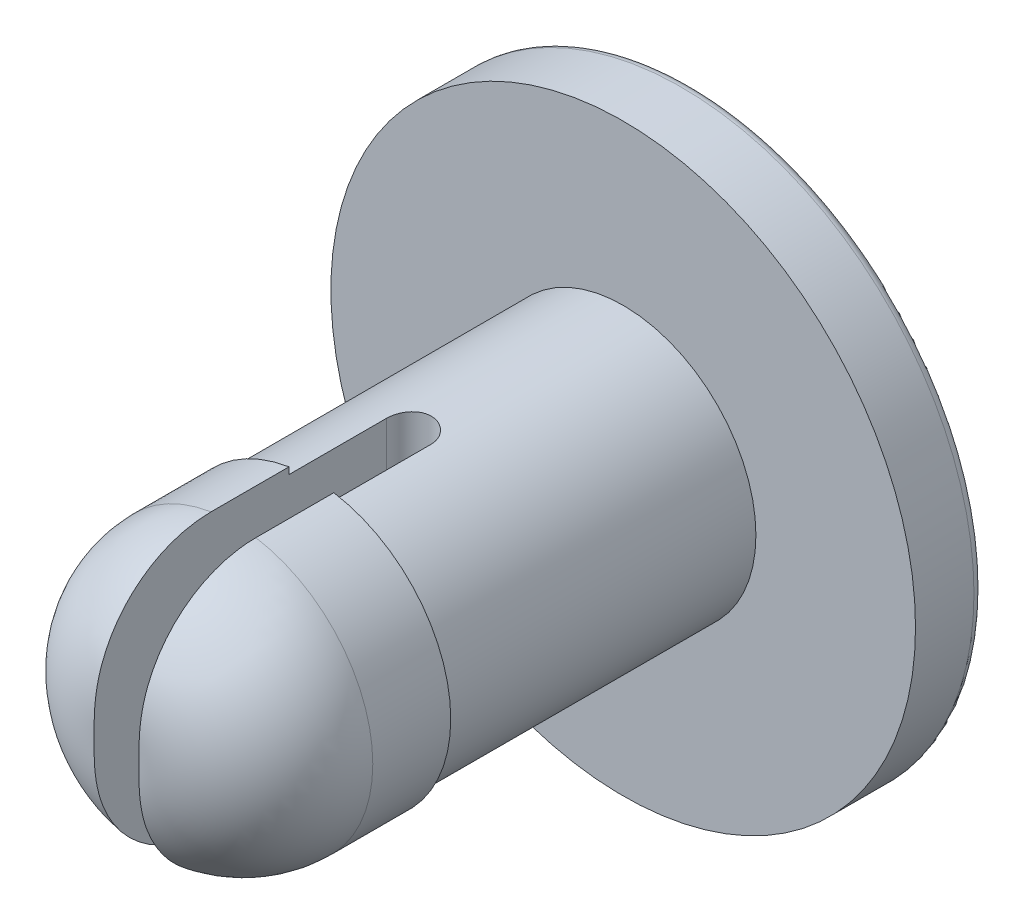
ISO-10303-21;
HEADER;
FILE_DESCRIPTION(('STEP AP214'),'2;1');
FILE_NAME('part.step','',(''),(''),'','','');
FILE_SCHEMA(('AUTOMOTIVE_DESIGN { 1 0 10303 214 1 1 1 1 }'));
ENDSEC;
DATA;
#1=APPLICATION_CONTEXT('core data for automotive mechanical design processes');
#2=APPLICATION_PROTOCOL_DEFINITION('international standard','automotive_design',2000,#1);
#3=PRODUCT_CONTEXT('',#1,'mechanical');
#4=PRODUCT('Part','Part','',(#3));
#5=PRODUCT_RELATED_PRODUCT_CATEGORY('part','',(#4));
#6=PRODUCT_DEFINITION_FORMATION('','',#4);
#7=PRODUCT_DEFINITION_CONTEXT('part definition',#1,'design');
#8=PRODUCT_DEFINITION('design','',#6,#7);
#9=PRODUCT_DEFINITION_SHAPE('','',#8);
#10=(LENGTH_UNIT() NAMED_UNIT(*) SI_UNIT(.MILLI.,.METRE.));
#11=(NAMED_UNIT(*) PLANE_ANGLE_UNIT() SI_UNIT($,.RADIAN.));
#12=(NAMED_UNIT(*) SI_UNIT($,.STERADIAN.) SOLID_ANGLE_UNIT());
#13=UNCERTAINTY_MEASURE_WITH_UNIT(LENGTH_MEASURE(1.E-05),#10,'distance_accuracy_value','');
#14=(GEOMETRIC_REPRESENTATION_CONTEXT(3) GLOBAL_UNCERTAINTY_ASSIGNED_CONTEXT((#13)) GLOBAL_UNIT_ASSIGNED_CONTEXT((#10,
#11,#12)) REPRESENTATION_CONTEXT('',''));
#15=CARTESIAN_POINT('',(0.,0.,0.));
#16=DIRECTION('',(0.,0.,1.));
#17=DIRECTION('',(1.,0.,0.));
#18=AXIS2_PLACEMENT_3D('',#15,#16,#17);
#19=CARTESIAN_POINT('',(0.,0.,14.75));
#20=DIRECTION('',(0.,0.,-1.));
#21=DIRECTION('',(-1.,0.,0.));
#22=AXIS2_PLACEMENT_3D('',#19,#20,#21);
#23=CYLINDRICAL_SURFACE('',#22,3.575);
#24=CARTESIAN_POINT('',(0.,0.,11.75));
#25=DIRECTION('',(0.,0.,1.));
#26=DIRECTION('',(1.,0.,0.));
#27=AXIS2_PLACEMENT_3D('',#24,#25,#26);
#28=CIRCLE('',#27,3.575);
#29=CARTESIAN_POINT('',(0.575,3.52845575287547,11.75));
#30=VERTEX_POINT('',#29);
#31=CARTESIAN_POINT('',(0.575,-3.52845575287547,11.75));
#32=VERTEX_POINT('',#31);
#33=EDGE_CURVE('E190',#30,#32,#28,.F.);
#34=ORIENTED_EDGE('',*,*,#33,.T.);
#35=DIRECTION('',(0.,0.,-1.));
#36=VECTOR('',#35,1.);
#37=CARTESIAN_POINT('',(0.575,-3.52845575287547,14.75));
#38=LINE('',#37,#36);
#39=CARTESIAN_POINT('',(0.575,-3.52845575287547,9.75));
#40=VERTEX_POINT('',#39);
#41=EDGE_CURVE('E192',#32,#40,#38,.T.);
#42=ORIENTED_EDGE('',*,*,#41,.T.);
#43=CARTESIAN_POINT('',(0.,0.,9.75));
#44=DIRECTION('',(0.,0.,1.));
#45=DIRECTION('',(1.,0.,0.));
#46=AXIS2_PLACEMENT_3D('',#43,#44,#45);
#47=CIRCLE('',#46,3.575);
#48=CARTESIAN_POINT('',(0.575,3.52845575287547,9.75));
#49=VERTEX_POINT('',#48);
#50=EDGE_CURVE('E262',#40,#49,#47,.T.);
#51=ORIENTED_EDGE('',*,*,#50,.T.);
#52=DIRECTION('',(0.,0.,-1.));
#53=VECTOR('',#52,1.);
#54=CARTESIAN_POINT('',(0.575,3.52845575287547,14.75));
#55=LINE('',#54,#53);
#56=EDGE_CURVE('E194',#49,#30,#55,.F.);
#57=ORIENTED_EDGE('',*,*,#56,.T.);
#58=EDGE_LOOP('',(#34,#42,#51,#57));
#59=FACE_BOUND('',#58,.T.);
#60=ADVANCED_FACE('F45',(#59),#23,.T.);
#61=CARTESIAN_POINT('',(0.,0.,9.75));
#62=DIRECTION('',(0.,0.,1.));
#63=DIRECTION('',(1.,0.,0.));
#64=AXIS2_PLACEMENT_3D('',#61,#62,#63);
#65=PLANE('',#64);
#66=ORIENTED_EDGE('',*,*,#50,.F.);
#67=DIRECTION('',(0.,1.,0.));
#68=VECTOR('',#67,1.);
#69=CARTESIAN_POINT('',(0.575,0.,9.75));
#70=LINE('',#69,#68);
#71=CARTESIAN_POINT('',(0.575,-3.35609892583636,9.75));
#72=VERTEX_POINT('',#71);
#73=EDGE_CURVE('E271',#40,#72,#70,.T.);
#74=ORIENTED_EDGE('',*,*,#73,.T.);
#75=CARTESIAN_POINT('',(0.,0.,9.75));
#76=DIRECTION('',(0.,0.,1.));
#77=DIRECTION('',(1.,0.,0.));
#78=AXIS2_PLACEMENT_3D('',#75,#76,#77);
#79=CIRCLE('',#78,3.405);
#80=CARTESIAN_POINT('',(0.575,3.35609892583636,9.75));
#81=VERTEX_POINT('',#80);
#82=EDGE_CURVE('E258',#72,#81,#79,.T.);
#83=ORIENTED_EDGE('',*,*,#82,.T.);
#84=EDGE_CURVE('E272',#81,#49,#70,.T.);
#85=ORIENTED_EDGE('',*,*,#84,.T.);
#86=EDGE_LOOP('',(#66,#74,#83,#85));
#87=FACE_BOUND('',#86,.T.);
#88=ADVANCED_FACE('F170',(#87),#65,.F.);
#89=CARTESIAN_POINT('',(0.,0.,11.75));
#90=DIRECTION('',(0.,0.,1.));
#91=DIRECTION('',(1.,0.,0.));
#92=AXIS2_PLACEMENT_3D('',#89,#90,#91);
#93=DEGENERATE_TOROIDAL_SURFACE('',#92,0.575,3.,.T.);
#94=ORIENTED_EDGE('',*,*,#33,.F.);
#95=CARTESIAN_POINT('',(0.575,0.,14.7500000000003));
#96=CARTESIAN_POINT('',(0.575,0.0479599910289937,14.7499991412129));
#97=CARTESIAN_POINT('',(0.575,0.0959199947458596,14.7500179982622));
#98=CARTESIAN_POINT('',(0.575,0.191832562200003,14.7498772513586));
#99=CARTESIAN_POINT('',(0.575,0.23978512593959,14.7497176750342));
#100=CARTESIAN_POINT('',(0.575,0.33563694348702,14.7487424297266));
#101=CARTESIAN_POINT('',(0.575,0.38353620095613,14.7479274420565));
#102=CARTESIAN_POINT('',(0.575,0.479301862870731,14.7451708436416));
#103=CARTESIAN_POINT('',(0.575,0.527168267673822,14.743229245361));
#104=CARTESIAN_POINT('',(0.575,0.672461643034071,14.7350320846635));
#105=CARTESIAN_POINT('',(0.575,0.769779333272116,14.7263907062388));
#106=CARTESIAN_POINT('',(0.575,0.963396748975621,14.7010961388807));
#107=CARTESIAN_POINT('',(0.575,1.05969647809974,14.6844429787526));
#108=CARTESIAN_POINT('',(0.575,1.25042136801084,14.6425269643835));
#109=CARTESIAN_POINT('',(0.575,1.34484648739453,14.6172639202049));
#110=CARTESIAN_POINT('',(0.575,1.53095011334402,14.5579784133012));
#111=CARTESIAN_POINT('',(0.575,1.6226276813196,14.5239529944972));
#112=CARTESIAN_POINT('',(0.575,1.80030549538096,14.4481326880269));
#113=CARTESIAN_POINT('',(0.575,1.88638669086819,14.4065276036336));
#114=CARTESIAN_POINT('',(0.575,2.05422262004047,14.3153555555573));
#115=CARTESIAN_POINT('',(0.575,2.13597747313636,14.2657888117755));
#116=CARTESIAN_POINT('',(0.575,2.29446562359141,14.1590336445313));
#117=CARTESIAN_POINT('',(0.575,2.37119439215784,14.1018384845442));
#118=CARTESIAN_POINT('',(0.575,2.51879832517957,13.9803866214287));
#119=CARTESIAN_POINT('',(0.575,2.58967400180558,13.9161305373107));
#120=CARTESIAN_POINT('',(0.575,2.77702057827132,13.7290508451309));
#121=CARTESIAN_POINT('',(0.575,2.88662335027905,13.5991986196902));
#122=CARTESIAN_POINT('',(0.575,3.08200511305904,13.3229073404814));
#123=CARTESIAN_POINT('',(0.575,3.16780344102312,13.1764818866905));
#124=CARTESIAN_POINT('',(0.575,3.31235217931218,12.8729932564601));
#125=CARTESIAN_POINT('',(0.575,3.37141647667744,12.7160797628945));
#126=CARTESIAN_POINT('',(0.575,3.46228387035127,12.394526258259));
#127=CARTESIAN_POINT('',(0.575,3.49408321071544,12.2298851859532));
#128=CARTESIAN_POINT('',(0.575,3.52943736331524,11.8980992056835));
#129=CARTESIAN_POINT('',(0.575,3.53307671741405,11.7309633027567));
#130=CARTESIAN_POINT('',(0.575,3.51222724877617,11.3984387639373));
#131=CARTESIAN_POINT('',(0.575,3.48773570703064,11.2330502985038));
#132=CARTESIAN_POINT('',(0.575,3.41133734090401,10.9087910224172));
#133=CARTESIAN_POINT('',(0.575,3.3594397374322,10.7499180389602));
#134=CARTESIAN_POINT('',(0.575,3.22976447307926,10.4432140966451));
#135=CARTESIAN_POINT('',(0.575,3.15200062300593,10.2953772966862));
#136=CARTESIAN_POINT('',(0.575,2.97277186425385,10.0147475913224));
#137=CARTESIAN_POINT('',(0.575,2.87129616535442,9.88196157584405));
#138=CARTESIAN_POINT('',(0.575,2.64741828195816,9.63501309078978));
#139=CARTESIAN_POINT('',(0.575,2.52498065079896,9.52088281783979));
#140=CARTESIAN_POINT('',(0.575,2.26201782998047,9.31403458858148));
#141=CARTESIAN_POINT('',(0.575,2.12139865463877,9.22143542900224));
#142=CARTESIAN_POINT('',(0.575,1.90094066265467,9.10123491149998));
#143=CARTESIAN_POINT('',(0.575,1.82601928077855,9.06433743475622));
#144=CARTESIAN_POINT('',(0.575,1.67337233185528,8.99679043890362));
#145=CARTESIAN_POINT('',(0.575,1.59564623277232,8.96614211262737));
#146=CARTESIAN_POINT('',(0.575,1.43693869532928,8.91086517914634));
#147=CARTESIAN_POINT('',(0.575,1.35592781837499,8.88632143549156));
#148=CARTESIAN_POINT('',(0.575,1.19225090748555,8.84377361023155));
#149=CARTESIAN_POINT('',(0.575,1.10958563192291,8.82576660150918));
#150=CARTESIAN_POINT('',(0.575,0.942535247043865,8.79594467838634));
#151=CARTESIAN_POINT('',(0.575,0.858141992762495,8.78417586820207));
#152=CARTESIAN_POINT('',(0.575,0.688736722387002,8.76641554939411));
#153=CARTESIAN_POINT('',(0.575,0.603724463702506,8.7604264439515));
#154=CARTESIAN_POINT('',(0.575,0.44944935022267,8.75354363320153));
#155=CARTESIAN_POINT('',(0.575,0.380213763905963,8.75190658992261));
#156=CARTESIAN_POINT('',(0.575,0.241718360224682,8.75015837504525));
#157=CARTESIAN_POINT('',(0.575,0.172458540785936,8.75004750982229));
#158=CARTESIAN_POINT('',(0.575,0.068527560856317,8.7499973275468));
#159=CARTESIAN_POINT('',(0.575,0.0338557234246653,8.74999999008686));
#160=CARTESIAN_POINT('',(0.575,-0.0354879495451869,8.75000000991324));
#161=CARTESIAN_POINT('',(0.575,-0.0701597850833441,8.74999736720562));
#162=CARTESIAN_POINT('',(0.575,-0.174175592702176,8.75005018322577));
#163=CARTESIAN_POINT('',(0.575,-0.243520016759352,8.75016638582052));
#164=CARTESIAN_POINT('',(0.575,-0.381765624570001,8.75194067632099));
#165=CARTESIAN_POINT('',(0.575,-0.450666863896799,8.75358910141183));
#166=CARTESIAN_POINT('',(0.575,-0.58834572032591,8.75974932097495));
#167=CARTESIAN_POINT('',(0.575,-0.657123354579998,8.764260681485));
#168=CARTESIAN_POINT('',(0.575,-0.794173076198699,8.77691149122077));
#169=CARTESIAN_POINT('',(0.575,-0.862446016931903,8.78504137983715));
#170=CARTESIAN_POINT('',(0.575,-0.998389857807109,8.80534203494857));
#171=CARTESIAN_POINT('',(0.575,-1.06606077896101,8.81751265983977));
#172=CARTESIAN_POINT('',(0.575,-1.21716099908607,8.84964325476365));
#173=CARTESIAN_POINT('',(0.575,-1.30034303124201,8.87078577932007));
#174=CARTESIAN_POINT('',(0.575,-1.46479494978354,8.91984281878721));
#175=CARTESIAN_POINT('',(0.575,-1.54606245551717,8.94776532229379));
#176=CARTESIAN_POINT('',(0.575,-1.70595337642327,9.01031005248946));
#177=CARTESIAN_POINT('',(0.575,-1.78457759193779,9.04493022940038));
#178=CARTESIAN_POINT('',(0.575,-1.93857319040189,9.12069238282417));
#179=CARTESIAN_POINT('',(0.575,-2.0139460622768,9.16183133290256));
#180=CARTESIAN_POINT('',(0.575,-2.16100777005591,9.25045993168252));
#181=CARTESIAN_POINT('',(0.575,-2.23269154353323,9.29795800116097));
#182=CARTESIAN_POINT('',(0.575,-2.37171013697071,9.39892619582676));
#183=CARTESIAN_POINT('',(0.575,-2.4390442015144,9.45239735398652));
#184=CARTESIAN_POINT('',(0.575,-2.63381909294934,9.62132193415628));
#185=CARTESIAN_POINT('',(0.575,-2.75405632043521,9.7453007531947));
#186=CARTESIAN_POINT('',(0.575,-2.96879004550762,10.0090733047604));
#187=CARTESIAN_POINT('',(0.575,-3.06380560133856,10.1484476353145));
#188=CARTESIAN_POINT('',(0.575,-3.22887129870692,10.4412123488175));
#189=CARTESIAN_POINT('',(0.575,-3.29893379833932,10.5945957462987));
#190=CARTESIAN_POINT('',(0.575,-3.41168670668405,10.9099098633585));
#191=CARTESIAN_POINT('',(0.575,-3.45456242265776,11.0717743944807));
#192=CARTESIAN_POINT('',(0.575,-3.51247876787784,11.4004316192547));
#193=CARTESIAN_POINT('',(0.575,-3.52751625516098,11.5672248670283));
#194=CARTESIAN_POINT('',(0.575,-3.52930795424931,11.9006189528432));
#195=CARTESIAN_POINT('',(0.575,-3.51612011430437,12.0672194838406));
#196=CARTESIAN_POINT('',(0.575,-3.46195720983408,12.3958511463293));
#197=CARTESIAN_POINT('',(0.575,-3.42098048733543,12.5578820045786));
#198=CARTESIAN_POINT('',(0.575,-3.31241403755377,12.8727791564908));
#199=CARTESIAN_POINT('',(0.575,-3.24482229018123,13.0256447534921));
#200=CARTESIAN_POINT('',(0.575,-3.0849947504769,13.3178243179938));
#201=CARTESIAN_POINT('',(0.575,-2.99276854627004,13.4571435292487));
#202=CARTESIAN_POINT('',(0.575,-2.78621262431414,13.7185403382491));
#203=CARTESIAN_POINT('',(0.575,-2.67185632524166,13.8405968928826));
#204=CARTESIAN_POINT('',(0.575,-2.42414902411836,14.0640915669687));
#205=CARTESIAN_POINT('',(0.575,-2.29077396185854,14.1655031683172));
#206=CARTESIAN_POINT('',(0.575,-2.07917087731759,14.3002158262));
#207=CARTESIAN_POINT('',(0.575,-2.00641260944294,14.3423465041849));
#208=CARTESIAN_POINT('',(0.575,-1.85762585956692,14.4204229741512));
#209=CARTESIAN_POINT('',(0.575,-1.78159733744112,14.456368690219));
#210=CARTESIAN_POINT('',(0.575,-1.62712896515148,14.5217519637556));
#211=CARTESIAN_POINT('',(0.575,-1.54869899647824,14.5512129386206));
#212=CARTESIAN_POINT('',(0.575,-1.38972508865614,14.6037130974403));
#213=CARTESIAN_POINT('',(0.575,-1.30918115384725,14.6267522945777));
#214=CARTESIAN_POINT('',(0.575,-1.12803004742938,14.6709722209561));
#215=CARTESIAN_POINT('',(0.575,-1.02702679978793,14.690537980588));
#216=CARTESIAN_POINT('',(0.575,-0.823703067693475,14.7205803168352));
#217=CARTESIAN_POINT('',(0.575,-0.721382441941373,14.7310559100768));
#218=CARTESIAN_POINT('',(0.575,-0.567378183989949,14.7412576606692));
#219=CARTESIAN_POINT('',(0.575,-0.515848091997465,14.7437390161707));
#220=CARTESIAN_POINT('',(0.575,-0.412736470801467,14.7472836577622));
#221=CARTESIAN_POINT('',(0.575,-0.361154938444676,14.7483468507924));
#222=CARTESIAN_POINT('',(0.575,-0.257977057278723,14.7496229300072));
#223=CARTESIAN_POINT('',(0.575,-0.206380707441016,14.7498356717515));
#224=CARTESIAN_POINT('',(0.575,-0.103189576631836,14.7500246652872));
#225=CARTESIAN_POINT('',(0.575,-0.0515947956578849,14.7500009238737));
#226=CARTESIAN_POINT('',(0.575,0.,14.7500000000003));
#227=B_SPLINE_CURVE_WITH_KNOTS('',3,(#95,#96,#97,#98,#99,#100,#101,#102,#103,#104,#105,#106,
#107,#108,#109,#110,#111,#112,#113,#114,#115,#116,#117,#118,#119,#120,#121,#122,#123,#124,#125,
#126,#127,#128,#129,#130,#131,#132,#133,#134,#135,#136,#137,#138,#139,#140,#141,#142,#143,#144,
#145,#146,#147,#148,#149,#150,#151,#152,#153,#154,#155,#156,#157,#158,#159,#160,#161,#162,#163,
#164,#165,#166,#167,#168,#169,#170,#171,#172,#173,#174,#175,#176,#177,#178,#179,#180,#181,#182,
#183,#184,#185,#186,#187,#188,#189,#190,#191,#192,#193,#194,#195,#196,#197,#198,#199,#200,#201,
#202,#203,#204,#205,#206,#207,#208,#209,#210,#211,#212,#213,#214,#215,#216,#217,#218,#219,#220,
#221,#222,#223,#224,#225,#226),.UNSPECIFIED.,.T.,.F.,(4,2,2,2,2,2,2,2,2,2,2,2,2,2,2,2,2,2,2,2,2,
2,2,2,2,2,2,2,2,2,2,2,2,2,2,2,2,2,2,2,2,2,2,2,2,2,2,2,2,2,2,2,2,2,2,2,2,2,2,2,2,2,2,2,2,4),(0.,
0.143880000540278,0.2877377258834,0.43144610127396,0.575152886774315,0.867968947344715,
1.16078395514467,1.45360542298155,1.74652580691722,2.0329259395156,2.31931816309227,
2.60596499030432,2.89258670805081,3.39970070259918,3.9064015362654,4.40698815041654,
4.90764371290844,5.4067956227147,5.90599578241268,6.4050280905811,6.90379437616826,
7.40278807190859,7.90263405509752,8.40517572289085,8.6554878579734,8.90584772778969,
9.15951466095088,9.41306786279993,9.66846973784353,9.92397776239912,10.131711944561,
10.3394878281047,10.4435035866399,10.5475192260912,10.7555500520708,10.9622777883529,
11.1689741964364,11.3751276987052,11.5812739772788,11.8384669966073,12.0959645400487,
12.3533834023985,12.6106831026055,12.868326953992,13.1260154309044,13.641310442957,
14.1449920010265,14.6484237608923,15.1483861215639,15.6484049070758,16.1473981096126,
16.6464210862936,17.145481946293,17.6443488461434,18.1438187160422,18.6439261541233,
18.8959136451711,19.1479042288654,19.398969337071,19.6500339298802,19.9582105443363,
20.2664204931631,20.4211729193059,20.5759354997991,20.7307243639885,20.8855087804961),.UNSPECIFIED.);
#228=EDGE_CURVE('E143',#32,#30,#227,.T.);
#229=ORIENTED_EDGE('',*,*,#228,.F.);
#230=EDGE_LOOP('',(#94,#229));
#231=FACE_BOUND('',#230,.T.);
#232=ADVANCED_FACE('F184',(#231),#93,.T.);
#233=CARTESIAN_POINT('',(0.,0.,1.75));
#234=DIRECTION('',(0.,0.,-1.));
#235=DIRECTION('',(-1.,0.,0.));
#236=AXIS2_PLACEMENT_3D('',#233,#234,#235);
#237=CYLINDRICAL_SURFACE('',#236,7.5);
#238=CARTESIAN_POINT('',(0.,0.,0.25));
#239=DIRECTION('',(0.,0.,1.));
#240=DIRECTION('',(1.,0.,0.));
#241=AXIS2_PLACEMENT_3D('',#238,#239,#240);
#242=CIRCLE('',#241,7.5);
#243=CARTESIAN_POINT('',(7.5,0.,0.25));
#244=VERTEX_POINT('',#243);
#245=EDGE_CURVE('E249',#244,#244,#242,.T.);
#246=ORIENTED_EDGE('',*,*,#245,.T.);
#247=EDGE_LOOP('',(#246));
#248=FACE_BOUND('',#247,.T.);
#249=CARTESIAN_POINT('',(0.,0.,1.75));
#250=DIRECTION('',(0.,0.,1.));
#251=DIRECTION('',(1.,0.,0.));
#252=AXIS2_PLACEMENT_3D('',#249,#250,#251);
#253=CIRCLE('',#252,7.5);
#254=CARTESIAN_POINT('',(7.5,0.,1.75));
#255=VERTEX_POINT('',#254);
#256=EDGE_CURVE('E251',#255,#255,#253,.T.);
#257=ORIENTED_EDGE('',*,*,#256,.F.);
#258=EDGE_LOOP('',(#257));
#259=FACE_BOUND('',#258,.T.);
#260=ADVANCED_FACE('F225',(#248,#259),#237,.T.);
#261=CARTESIAN_POINT('',(0.,0.,1.75));
#262=DIRECTION('',(0.,0.,1.));
#263=DIRECTION('',(1.,0.,0.));
#264=AXIS2_PLACEMENT_3D('',#261,#262,#263);
#265=PLANE('',#264);
#266=CARTESIAN_POINT('',(0.,0.,1.75));
#267=DIRECTION('',(0.,0.,1.));
#268=DIRECTION('',(1.,0.,0.));
#269=AXIS2_PLACEMENT_3D('',#266,#267,#268);
#270=CIRCLE('',#269,3.405);
#271=CARTESIAN_POINT('',(3.405,0.,1.75));
#272=VERTEX_POINT('',#271);
#273=EDGE_CURVE('E199',#272,#272,#270,.T.);
#274=ORIENTED_EDGE('',*,*,#273,.F.);
#275=EDGE_LOOP('',(#274));
#276=FACE_BOUND('',#275,.T.);
#277=ORIENTED_EDGE('',*,*,#256,.T.);
#278=EDGE_LOOP('',(#277));
#279=FACE_BOUND('',#278,.T.);
#280=ADVANCED_FACE('F229',(#276,#279),#265,.T.);
#281=CARTESIAN_POINT('',(0.,0.,0.));
#282=DIRECTION('',(0.,0.,1.));
#283=DIRECTION('',(1.,0.,0.));
#284=AXIS2_PLACEMENT_3D('',#281,#282,#283);
#285=PLANE('',#284);
#286=CARTESIAN_POINT('',(0.,0.,0.));
#287=DIRECTION('',(0.,0.,1.));
#288=DIRECTION('',(1.,0.,0.));
#289=AXIS2_PLACEMENT_3D('',#286,#287,#288);
#290=CIRCLE('',#289,7.25);
#291=CARTESIAN_POINT('',(7.25,0.,0.));
#292=VERTEX_POINT('',#291);
#293=EDGE_CURVE('E204',#292,#292,#290,.F.);
#294=ORIENTED_EDGE('',*,*,#293,.T.);
#295=EDGE_LOOP('',(#294));
#296=FACE_BOUND('',#295,.T.);
#297=ADVANCED_FACE('F235',(#296),#285,.F.);
#298=CARTESIAN_POINT('',(0.,0.,0.25));
#299=DIRECTION('',(0.,0.,1.));
#300=DIRECTION('',(1.,0.,0.));
#301=AXIS2_PLACEMENT_3D('',#298,#299,#300);
#302=TOROIDAL_SURFACE('',#301,7.25,0.25);
#303=ORIENTED_EDGE('',*,*,#293,.F.);
#304=EDGE_LOOP('',(#303));
#305=FACE_BOUND('',#304,.T.);
#306=ORIENTED_EDGE('',*,*,#245,.F.);
#307=EDGE_LOOP('',(#306));
#308=FACE_BOUND('',#307,.T.);
#309=ADVANCED_FACE('F176',(#305,#308),#302,.T.);
#310=CARTESIAN_POINT('',(0.,0.,9.75));
#311=DIRECTION('',(0.,0.,-1.));
#312=DIRECTION('',(-1.,0.,0.));
#313=AXIS2_PLACEMENT_3D('',#310,#311,#312);
#314=CYLINDRICAL_SURFACE('',#313,3.405);
#315=CARTESIAN_POINT('',(-0.575,3.35609892583636,7.25));
#316=CARTESIAN_POINT('',(-0.575028553460308,3.35608091234908,7.21789614390163));
#317=CARTESIAN_POINT('',(-0.57231316122703,3.35655909033629,7.18580575269618));
#318=CARTESIAN_POINT('',(-0.561611498058461,3.35837313609114,7.1225829409983));
#319=CARTESIAN_POINT('',(-0.553632226183392,3.35970786489128,7.09144930581698));
#320=CARTESIAN_POINT('',(-0.532616530332993,3.36310134226726,7.03097468846981));
#321=CARTESIAN_POINT('',(-0.519579028785024,3.36516024510774,7.0016340898236));
#322=CARTESIAN_POINT('',(-0.488835438029434,3.36976368032886,6.94555467374316));
#323=CARTESIAN_POINT('',(-0.471129262369008,3.37230822170214,6.91881590450121));
#324=CARTESIAN_POINT('',(-0.43136043022401,3.37762602666929,6.86843418228707));
#325=CARTESIAN_POINT('',(-0.40926022478589,3.38040113244897,6.84482105814915));
#326=CARTESIAN_POINT('',(-0.361409912485525,3.38585097187183,6.80161726303588));
#327=CARTESIAN_POINT('',(-0.335659246823948,3.3885256900686,6.78202720902393));
#328=CARTESIAN_POINT('',(-0.281044997136995,3.39349288028389,6.74731532676686));
#329=CARTESIAN_POINT('',(-0.252163339195771,3.39578291465484,6.73222155647942));
#330=CARTESIAN_POINT('',(-0.192231033951128,3.39970188348304,6.7071118412523));
#331=CARTESIAN_POINT('',(-0.161180654837275,3.40133089951444,6.69709526971384));
#332=CARTESIAN_POINT('',(-0.0981023249580895,3.40373136579406,6.68251531984894));
#333=CARTESIAN_POINT('',(-0.0660863923628076,3.40451077839036,6.67790127898832));
#334=CARTESIAN_POINT('',(-0.00172517098452716,3.40515159150105,6.67409976984125));
#335=CARTESIAN_POINT('',(0.0306201025762815,3.40501303425355,6.67491205187594));
#336=CARTESIAN_POINT('',(0.0943736783540715,3.40383978028279,6.68190088586224));
#337=CARTESIAN_POINT('',(0.125788165728134,3.40281421676883,6.68802276840947));
#338=CARTESIAN_POINT('',(0.187137303725755,3.399992384238,6.70537086500291));
#339=CARTESIAN_POINT('',(0.217071917843988,3.39819609621955,6.71659720489565));
#340=CARTESIAN_POINT('',(0.274774466237098,3.39401909188096,6.74388985257192));
#341=CARTESIAN_POINT('',(0.30253153311382,3.39163566315497,6.75997870420084));
#342=CARTESIAN_POINT('',(0.354971460710831,3.38654918337844,6.79652258720238));
#343=CARTESIAN_POINT('',(0.379654179437337,3.38384611757616,6.81697782012511));
#344=CARTESIAN_POINT('',(0.425566015223457,3.37838136637451,6.86197370785934));
#345=CARTESIAN_POINT('',(0.446748784074379,3.375619369165,6.88656163743122));
#346=CARTESIAN_POINT('',(0.484701577803032,3.37037946155732,6.9389754478981));
#347=CARTESIAN_POINT('',(0.501470347236478,3.36790163209592,6.96680224676443));
#348=CARTESIAN_POINT('',(0.530128792999367,3.36351004878725,7.02496235562378));
#349=CARTESIAN_POINT('',(0.542009923360474,3.36159728458034,7.05529994541959));
#350=CARTESIAN_POINT('',(0.560477635561629,3.35856798090226,7.11755912055766));
#351=CARTESIAN_POINT('',(0.567072130667574,3.35745025167194,7.14947826222808));
#352=CARTESIAN_POINT('',(0.572285888587643,3.35656294591983,7.19303410276371));
#353=CARTESIAN_POINT('',(0.573304101006304,3.3563890959323,7.2044128426278));
#354=CARTESIAN_POINT('',(0.574660272744341,3.35615720174549,7.22719272616396));
#355=CARTESIAN_POINT('',(0.574999376016171,3.35609896280205,7.23859379972343));
#356=CARTESIAN_POINT('',(0.575000000000001,3.35609892583637,7.25));
#357=B_SPLINE_CURVE_WITH_KNOTS('',3,(#315,#316,#317,#318,#319,#320,#321,#322,#323,#324,#325,
#326,#327,#328,#329,#330,#331,#332,#333,#334,#335,#336,#337,#338,#339,#340,#341,#342,#343,#344,
#345,#346,#347,#348,#349,#350,#351,#352,#353,#354,#355,#356),.UNSPECIFIED.,.F.,.F.,(4,2,2,2,2,2,
2,2,2,2,2,2,2,2,2,2,2,2,2,2,4),(0.,0.0961731624966529,0.192218706439643,0.28828472255097,
0.384352517702736,0.481279566923373,0.578221469442101,0.675756217445887,0.773278925337352,
0.869879592263948,0.966475814379733,1.06208910060606,1.15770474423314,1.25377066973883,
1.34984103056191,1.44709624196097,1.5443790851921,1.6418313104581,1.73913739119283,
1.77339833211336,1.80760151211994),.UNSPECIFIED.);
#358=CARTESIAN_POINT('',(-0.575,3.35609892583636,7.25));
#359=VERTEX_POINT('',#358);
#360=CARTESIAN_POINT('',(0.575,3.35609892583636,7.25));
#361=VERTEX_POINT('',#360);
#362=EDGE_CURVE('E11',#359,#361,#357,.T.);
#363=ORIENTED_EDGE('',*,*,#362,.T.);
#364=DIRECTION('',(0.,0.,-1.));
#365=VECTOR('',#364,1.);
#366=CARTESIAN_POINT('',(0.575,3.35609892583636,9.75));
#367=LINE('',#366,#365);
#368=EDGE_CURVE('E267',#361,#81,#367,.F.);
#369=ORIENTED_EDGE('',*,*,#368,.T.);
#370=ORIENTED_EDGE('',*,*,#82,.F.);
#371=DIRECTION('',(0.,0.,-1.));
#372=VECTOR('',#371,1.);
#373=CARTESIAN_POINT('',(0.575,-3.35609892583636,9.75));
#374=LINE('',#373,#372);
#375=CARTESIAN_POINT('',(0.575,-3.35609892583636,7.25));
#376=VERTEX_POINT('',#375);
#377=EDGE_CURVE('E76',#72,#376,#374,.T.);
#378=ORIENTED_EDGE('',*,*,#377,.T.);
#379=CARTESIAN_POINT('',(0.575,-3.35609892583636,7.25));
#380=CARTESIAN_POINT('',(0.575028553460309,-3.35608091234908,7.21789614390162));
#381=CARTESIAN_POINT('',(0.57231316122703,-3.35655909033629,7.18580575269618));
#382=CARTESIAN_POINT('',(0.561611498058461,-3.35837313609114,7.1225829409983));
#383=CARTESIAN_POINT('',(0.553632226183392,-3.35970786489128,7.09144930581698));
#384=CARTESIAN_POINT('',(0.532616530332994,-3.36310134226726,7.03097468846981));
#385=CARTESIAN_POINT('',(0.519579028785024,-3.36516024510774,7.0016340898236));
#386=CARTESIAN_POINT('',(0.488835438029435,-3.36976368032886,6.94555467374316));
#387=CARTESIAN_POINT('',(0.471129262369008,-3.37230822170214,6.91881590450121));
#388=CARTESIAN_POINT('',(0.431360430224011,-3.37762602666929,6.86843418228707));
#389=CARTESIAN_POINT('',(0.40926022478589,-3.38040113244897,6.84482105814915));
#390=CARTESIAN_POINT('',(0.361409912485526,-3.38585097187183,6.80161726303588));
#391=CARTESIAN_POINT('',(0.335659246823948,-3.3885256900686,6.78202720902393));
#392=CARTESIAN_POINT('',(0.281044997136995,-3.39349288028389,6.74731532676686));
#393=CARTESIAN_POINT('',(0.252163339195772,-3.39578291465484,6.73222155647942));
#394=CARTESIAN_POINT('',(0.192231033951128,-3.39970188348304,6.7071118412523));
#395=CARTESIAN_POINT('',(0.161180654837275,-3.40133089951444,6.69709526971384));
#396=CARTESIAN_POINT('',(0.0981023249580897,-3.40373136579406,6.68251531984894));
#397=CARTESIAN_POINT('',(0.0660863923628078,-3.40451077839036,6.67790127898832));
#398=CARTESIAN_POINT('',(0.00172517098452737,-3.40515159150105,6.67409976984125));
#399=CARTESIAN_POINT('',(-0.0306201025762812,-3.40501303425355,6.67491205187594));
#400=CARTESIAN_POINT('',(-0.0943736783540713,-3.40383978028279,6.68190088586224));
#401=CARTESIAN_POINT('',(-0.125788165728134,-3.40281421676883,6.68802276840947));
#402=CARTESIAN_POINT('',(-0.187137303725755,-3.399992384238,6.70537086500291));
#403=CARTESIAN_POINT('',(-0.217071917843988,-3.39819609621955,6.71659720489565));
#404=CARTESIAN_POINT('',(-0.274774466237098,-3.39401909188096,6.74388985257192));
#405=CARTESIAN_POINT('',(-0.30253153311382,-3.39163566315497,6.75997870420084));
#406=CARTESIAN_POINT('',(-0.35497146071083,-3.38654918337844,6.79652258720238));
#407=CARTESIAN_POINT('',(-0.379654179437337,-3.38384611757616,6.81697782012511));
#408=CARTESIAN_POINT('',(-0.425566015223457,-3.37838136637451,6.86197370785934));
#409=CARTESIAN_POINT('',(-0.446748784074379,-3.375619369165,6.88656163743122));
#410=CARTESIAN_POINT('',(-0.484701577803031,-3.37037946155732,6.9389754478981));
#411=CARTESIAN_POINT('',(-0.501470347236478,-3.36790163209592,6.96680224676443));
#412=CARTESIAN_POINT('',(-0.530128792999367,-3.36351004878725,7.02496235562378));
#413=CARTESIAN_POINT('',(-0.542009923360474,-3.36159728458034,7.05529994541959));
#414=CARTESIAN_POINT('',(-0.560477635561628,-3.35856798090226,7.11755912055766));
#415=CARTESIAN_POINT('',(-0.567072130667574,-3.35745025167194,7.14947826222808));
#416=CARTESIAN_POINT('',(-0.572285888587643,-3.35656294591983,7.19303410276371));
#417=CARTESIAN_POINT('',(-0.573304101006303,-3.3563890959323,7.2044128426278));
#418=CARTESIAN_POINT('',(-0.574660272744341,-3.35615720174549,7.22719272616396));
#419=CARTESIAN_POINT('',(-0.574999376016171,-3.35609896280205,7.23859379972343));
#420=CARTESIAN_POINT('',(-0.575000000000001,-3.35609892583637,7.25));
#421=B_SPLINE_CURVE_WITH_KNOTS('',3,(#379,#380,#381,#382,#383,#384,#385,#386,#387,#388,#389,
#390,#391,#392,#393,#394,#395,#396,#397,#398,#399,#400,#401,#402,#403,#404,#405,#406,#407,#408,
#409,#410,#411,#412,#413,#414,#415,#416,#417,#418,#419,#420),.UNSPECIFIED.,.F.,.F.,(4,2,2,2,2,2,
2,2,2,2,2,2,2,2,2,2,2,2,2,2,4),(0.,0.0961731624966529,0.192218706439643,0.28828472255097,
0.384352517702736,0.481279566923373,0.578221469442101,0.675756217445887,0.773278925337352,
0.869879592263948,0.966475814379733,1.06208910060606,1.15770474423314,1.25377066973883,
1.34984103056191,1.44709624196097,1.5443790851921,1.6418313104581,1.73913739119283,
1.77339833211336,1.80760151211994),.UNSPECIFIED.);
#422=CARTESIAN_POINT('',(-0.575,-3.35609892583636,7.25));
#423=VERTEX_POINT('',#422);
#424=EDGE_CURVE('E61',#376,#423,#421,.T.);
#425=ORIENTED_EDGE('',*,*,#424,.T.);
#426=DIRECTION('',(0.,0.,-1.));
#427=VECTOR('',#426,1.);
#428=CARTESIAN_POINT('',(-0.575,-3.35609892583636,9.75));
#429=LINE('',#428,#427);
#430=CARTESIAN_POINT('',(-0.575,-3.35609892583636,9.75));
#431=VERTEX_POINT('',#430);
#432=EDGE_CURVE('E118',#423,#431,#429,.F.);
#433=ORIENTED_EDGE('',*,*,#432,.T.);
#434=CARTESIAN_POINT('',(-0.575,3.35609892583636,9.75));
#435=VERTEX_POINT('',#434);
#436=EDGE_CURVE('E255',#435,#431,#79,.T.);
#437=ORIENTED_EDGE('',*,*,#436,.F.);
#438=DIRECTION('',(0.,0.,-1.));
#439=VECTOR('',#438,1.);
#440=CARTESIAN_POINT('',(-0.575,3.35609892583636,9.75));
#441=LINE('',#440,#439);
#442=EDGE_CURVE('E130',#435,#359,#441,.T.);
#443=ORIENTED_EDGE('',*,*,#442,.T.);
#444=EDGE_LOOP('',(#363,#369,#370,#378,#425,#433,#437,#443));
#445=FACE_BOUND('',#444,.T.);
#446=ORIENTED_EDGE('',*,*,#273,.T.);
#447=EDGE_LOOP('',(#446));
#448=FACE_BOUND('',#447,.T.);
#449=ADVANCED_FACE('F139',(#445,#448),#314,.T.);
#450=CARTESIAN_POINT('',(-0.575,-3.52845575287547,11.75));
#451=VERTEX_POINT('',#450);
#452=CARTESIAN_POINT('',(-0.575,3.52845575287547,11.75));
#453=VERTEX_POINT('',#452);
#454=EDGE_CURVE('E198',#451,#453,#28,.F.);
#455=ORIENTED_EDGE('',*,*,#454,.T.);
#456=DIRECTION('',(0.,0.,-1.));
#457=VECTOR('',#456,1.);
#458=CARTESIAN_POINT('',(-0.575,3.52845575287547,14.75));
#459=LINE('',#458,#457);
#460=CARTESIAN_POINT('',(-0.575,3.52845575287547,9.75));
#461=VERTEX_POINT('',#460);
#462=EDGE_CURVE('E68',#453,#461,#459,.T.);
#463=ORIENTED_EDGE('',*,*,#462,.T.);
#464=CARTESIAN_POINT('',(-0.575,-3.52845575287547,9.75));
#465=VERTEX_POINT('',#464);
#466=EDGE_CURVE('E218',#461,#465,#47,.T.);
#467=ORIENTED_EDGE('',*,*,#466,.T.);
#468=DIRECTION('',(0.,0.,-1.));
#469=VECTOR('',#468,1.);
#470=CARTESIAN_POINT('',(-0.575,-3.52845575287547,14.75));
#471=LINE('',#470,#469);
#472=EDGE_CURVE('E213',#465,#451,#471,.F.);
#473=ORIENTED_EDGE('',*,*,#472,.T.);
#474=EDGE_LOOP('',(#455,#463,#467,#473));
#475=FACE_BOUND('',#474,.T.);
#476=ADVANCED_FACE('F168',(#475),#23,.T.);
#477=ORIENTED_EDGE('',*,*,#466,.F.);
#478=DIRECTION('',(0.,-1.,0.));
#479=VECTOR('',#478,1.);
#480=CARTESIAN_POINT('',(-0.575,0.,9.75));
#481=LINE('',#480,#479);
#482=EDGE_CURVE('E131',#461,#435,#481,.T.);
#483=ORIENTED_EDGE('',*,*,#482,.T.);
#484=ORIENTED_EDGE('',*,*,#436,.T.);
#485=EDGE_CURVE('E124',#431,#465,#481,.T.);
#486=ORIENTED_EDGE('',*,*,#485,.T.);
#487=EDGE_LOOP('',(#477,#483,#484,#486));
#488=FACE_BOUND('',#487,.T.);
#489=ADVANCED_FACE('F165',(#488),#65,.F.);
#490=ORIENTED_EDGE('',*,*,#454,.F.);
#491=CARTESIAN_POINT('',(-0.575,0.,14.7500000000003));
#492=CARTESIAN_POINT('',(-0.575,-0.0479599910289937,14.7499991412129));
#493=CARTESIAN_POINT('',(-0.575,-0.0959199947458596,14.7500179982622));
#494=CARTESIAN_POINT('',(-0.575,-0.191832562200003,14.7498772513586));
#495=CARTESIAN_POINT('',(-0.575,-0.23978512593959,14.7497176750342));
#496=CARTESIAN_POINT('',(-0.575,-0.33563694348702,14.7487424297266));
#497=CARTESIAN_POINT('',(-0.575,-0.38353620095613,14.7479274420565));
#498=CARTESIAN_POINT('',(-0.575,-0.479301862870731,14.7451708436416));
#499=CARTESIAN_POINT('',(-0.575,-0.527168267673822,14.743229245361));
#500=CARTESIAN_POINT('',(-0.575,-0.672461643034071,14.7350320846635));
#501=CARTESIAN_POINT('',(-0.575,-0.769779333272116,14.7263907062388));
#502=CARTESIAN_POINT('',(-0.575,-0.963396748975621,14.7010961388807));
#503=CARTESIAN_POINT('',(-0.575,-1.05969647809974,14.6844429787526));
#504=CARTESIAN_POINT('',(-0.575,-1.25042136801084,14.6425269643835));
#505=CARTESIAN_POINT('',(-0.575,-1.34484648739453,14.6172639202049));
#506=CARTESIAN_POINT('',(-0.575,-1.53095011334402,14.5579784133012));
#507=CARTESIAN_POINT('',(-0.575,-1.6226276813196,14.5239529944972));
#508=CARTESIAN_POINT('',(-0.575,-1.80030549538096,14.4481326880269));
#509=CARTESIAN_POINT('',(-0.575,-1.88638669086819,14.4065276036336));
#510=CARTESIAN_POINT('',(-0.575,-2.05422262004047,14.3153555555573));
#511=CARTESIAN_POINT('',(-0.575,-2.13597747313636,14.2657888117755));
#512=CARTESIAN_POINT('',(-0.575,-2.29446562359141,14.1590336445313));
#513=CARTESIAN_POINT('',(-0.575,-2.37119439215784,14.1018384845442));
#514=CARTESIAN_POINT('',(-0.575,-2.51879832517957,13.9803866214287));
#515=CARTESIAN_POINT('',(-0.575,-2.58967400180558,13.9161305373107));
#516=CARTESIAN_POINT('',(-0.575,-2.77702057827132,13.7290508451309));
#517=CARTESIAN_POINT('',(-0.575,-2.88662335027905,13.5991986196902));
#518=CARTESIAN_POINT('',(-0.575,-3.08200511305904,13.3229073404814));
#519=CARTESIAN_POINT('',(-0.575,-3.16780344102312,13.1764818866905));
#520=CARTESIAN_POINT('',(-0.575,-3.31235217931218,12.8729932564601));
#521=CARTESIAN_POINT('',(-0.575,-3.37141647667744,12.7160797628945));
#522=CARTESIAN_POINT('',(-0.575,-3.46228387035127,12.394526258259));
#523=CARTESIAN_POINT('',(-0.575,-3.49408321071544,12.2298851859532));
#524=CARTESIAN_POINT('',(-0.575,-3.52943736331524,11.8980992056835));
#525=CARTESIAN_POINT('',(-0.575,-3.53307671741405,11.7309633027567));
#526=CARTESIAN_POINT('',(-0.575,-3.51222724877617,11.3984387639373));
#527=CARTESIAN_POINT('',(-0.575,-3.48773570703064,11.2330502985038));
#528=CARTESIAN_POINT('',(-0.575,-3.41133734090401,10.9087910224172));
#529=CARTESIAN_POINT('',(-0.575,-3.3594397374322,10.7499180389602));
#530=CARTESIAN_POINT('',(-0.575,-3.22976447307926,10.4432140966451));
#531=CARTESIAN_POINT('',(-0.575,-3.15200062300593,10.2953772966862));
#532=CARTESIAN_POINT('',(-0.575,-2.97277186425385,10.0147475913224));
#533=CARTESIAN_POINT('',(-0.575,-2.87129616535442,9.88196157584405));
#534=CARTESIAN_POINT('',(-0.575,-2.64741828195816,9.63501309078978));
#535=CARTESIAN_POINT('',(-0.575,-2.52498065079896,9.52088281783979));
#536=CARTESIAN_POINT('',(-0.575,-2.26201782998047,9.31403458858148));
#537=CARTESIAN_POINT('',(-0.575,-2.12139865463877,9.22143542900224));
#538=CARTESIAN_POINT('',(-0.575,-1.90094066265467,9.10123491149998));
#539=CARTESIAN_POINT('',(-0.575,-1.82601928077855,9.06433743475622));
#540=CARTESIAN_POINT('',(-0.575,-1.67337233185528,8.99679043890362));
#541=CARTESIAN_POINT('',(-0.575,-1.59564623277232,8.96614211262737));
#542=CARTESIAN_POINT('',(-0.575,-1.43693869532928,8.91086517914634));
#543=CARTESIAN_POINT('',(-0.575,-1.35592781837499,8.88632143549156));
#544=CARTESIAN_POINT('',(-0.575,-1.19225090748555,8.84377361023155));
#545=CARTESIAN_POINT('',(-0.575,-1.10958563192291,8.82576660150918));
#546=CARTESIAN_POINT('',(-0.575,-0.942535247043865,8.79594467838634));
#547=CARTESIAN_POINT('',(-0.575,-0.858141992762496,8.78417586820207));
#548=CARTESIAN_POINT('',(-0.575,-0.688736722387003,8.76641554939411));
#549=CARTESIAN_POINT('',(-0.575,-0.603724463702506,8.7604264439515));
#550=CARTESIAN_POINT('',(-0.575,-0.44944935022267,8.75354363320153));
#551=CARTESIAN_POINT('',(-0.575,-0.380213763905963,8.75190658992261));
#552=CARTESIAN_POINT('',(-0.575,-0.241718360224682,8.75015837504525));
#553=CARTESIAN_POINT('',(-0.575,-0.172458540785937,8.75004750982229));
#554=CARTESIAN_POINT('',(-0.575,-0.068527560856318,8.7499973275468));
#555=CARTESIAN_POINT('',(-0.575,-0.0338557234246666,8.74999999008686));
#556=CARTESIAN_POINT('',(-0.575,0.0354879495451858,8.75000000991324));
#557=CARTESIAN_POINT('',(-0.575,0.0701597850833434,8.74999736720562));
#558=CARTESIAN_POINT('',(-0.575,0.174175592702176,8.75005018322577));
#559=CARTESIAN_POINT('',(-0.575,0.243520016759352,8.75016638582052));
#560=CARTESIAN_POINT('',(-0.575,0.381765624570001,8.75194067632099));
#561=CARTESIAN_POINT('',(-0.575,0.450666863896799,8.75358910141183));
#562=CARTESIAN_POINT('',(-0.575,0.58834572032591,8.75974932097495));
#563=CARTESIAN_POINT('',(-0.575,0.657123354579998,8.764260681485));
#564=CARTESIAN_POINT('',(-0.575,0.794173076198699,8.77691149122077));
#565=CARTESIAN_POINT('',(-0.575,0.862446016931904,8.78504137983715));
#566=CARTESIAN_POINT('',(-0.575,0.99838985780711,8.80534203494857));
#567=CARTESIAN_POINT('',(-0.575,1.06606077896101,8.81751265983977));
#568=CARTESIAN_POINT('',(-0.575,1.21716099908607,8.84964325476365));
#569=CARTESIAN_POINT('',(-0.575,1.30034303124201,8.87078577932007));
#570=CARTESIAN_POINT('',(-0.575,1.46479494978354,8.91984281878721));
#571=CARTESIAN_POINT('',(-0.575,1.54606245551717,8.94776532229379));
#572=CARTESIAN_POINT('',(-0.575,1.70595337642327,9.01031005248946));
#573=CARTESIAN_POINT('',(-0.575,1.78457759193779,9.04493022940038));
#574=CARTESIAN_POINT('',(-0.575,1.93857319040189,9.12069238282417));
#575=CARTESIAN_POINT('',(-0.575,2.0139460622768,9.16183133290256));
#576=CARTESIAN_POINT('',(-0.575,2.16100777005591,9.25045993168252));
#577=CARTESIAN_POINT('',(-0.575,2.23269154353323,9.29795800116098));
#578=CARTESIAN_POINT('',(-0.575,2.37171013697072,9.39892619582676));
#579=CARTESIAN_POINT('',(-0.575,2.4390442015144,9.45239735398652));
#580=CARTESIAN_POINT('',(-0.575,2.63381909294935,9.62132193415629));
#581=CARTESIAN_POINT('',(-0.575,2.75405632043521,9.7453007531947));
#582=CARTESIAN_POINT('',(-0.575,2.96879004550762,10.0090733047604));
#583=CARTESIAN_POINT('',(-0.575,3.06380560133856,10.1484476353145));
#584=CARTESIAN_POINT('',(-0.575,3.22887129870692,10.4412123488175));
#585=CARTESIAN_POINT('',(-0.575,3.29893379833932,10.5945957462987));
#586=CARTESIAN_POINT('',(-0.575,3.41168670668405,10.9099098633585));
#587=CARTESIAN_POINT('',(-0.575,3.45456242265776,11.0717743944807));
#588=CARTESIAN_POINT('',(-0.575,3.51247876787784,11.4004316192547));
#589=CARTESIAN_POINT('',(-0.575,3.52751625516098,11.5672248670283));
#590=CARTESIAN_POINT('',(-0.575,3.52930795424931,11.9006189528432));
#591=CARTESIAN_POINT('',(-0.575,3.51612011430437,12.0672194838406));
#592=CARTESIAN_POINT('',(-0.575,3.46195720983408,12.3958511463293));
#593=CARTESIAN_POINT('',(-0.575,3.42098048733543,12.5578820045786));
#594=CARTESIAN_POINT('',(-0.575,3.31241403755377,12.8727791564908));
#595=CARTESIAN_POINT('',(-0.575,3.24482229018123,13.0256447534921));
#596=CARTESIAN_POINT('',(-0.575,3.0849947504769,13.3178243179938));
#597=CARTESIAN_POINT('',(-0.575,2.99276854627004,13.4571435292487));
#598=CARTESIAN_POINT('',(-0.575,2.78621262431414,13.7185403382491));
#599=CARTESIAN_POINT('',(-0.575,2.67185632524166,13.8405968928827));
#600=CARTESIAN_POINT('',(-0.575,2.42414902411836,14.0640915669687));
#601=CARTESIAN_POINT('',(-0.575,2.29077396185853,14.1655031683172));
#602=CARTESIAN_POINT('',(-0.575,2.07917087731758,14.3002158262));
#603=CARTESIAN_POINT('',(-0.575,2.00641260944293,14.3423465041849));
#604=CARTESIAN_POINT('',(-0.575,1.85762585956692,14.4204229741512));
#605=CARTESIAN_POINT('',(-0.575,1.78159733744112,14.456368690219));
#606=CARTESIAN_POINT('',(-0.575,1.62712896515147,14.5217519637556));
#607=CARTESIAN_POINT('',(-0.575,1.54869899647824,14.5512129386206));
#608=CARTESIAN_POINT('',(-0.575,1.38972508865614,14.6037130974403));
#609=CARTESIAN_POINT('',(-0.575,1.30918115384725,14.6267522945777));
#610=CARTESIAN_POINT('',(-0.575,1.12803004742938,14.6709722209561));
#611=CARTESIAN_POINT('',(-0.575,1.02702679978793,14.690537980588));
#612=CARTESIAN_POINT('',(-0.575,0.823703067693472,14.7205803168352));
#613=CARTESIAN_POINT('',(-0.575,0.721382441941372,14.7310559100768));
#614=CARTESIAN_POINT('',(-0.575,0.567378183989948,14.7412576606692));
#615=CARTESIAN_POINT('',(-0.575,0.515848091997464,14.7437390161707));
#616=CARTESIAN_POINT('',(-0.575,0.412736470801466,14.7472836577622));
#617=CARTESIAN_POINT('',(-0.575,0.361154938444675,14.7483468507924));
#618=CARTESIAN_POINT('',(-0.575,0.257977057278723,14.7496229300072));
#619=CARTESIAN_POINT('',(-0.575,0.206380707441015,14.7498356717515));
#620=CARTESIAN_POINT('',(-0.575,0.103189576631836,14.7500246652872));
#621=CARTESIAN_POINT('',(-0.575,0.0515947956578849,14.7500009238737));
#622=CARTESIAN_POINT('',(-0.575,0.,14.7500000000003));
#623=B_SPLINE_CURVE_WITH_KNOTS('',3,(#491,#492,#493,#494,#495,#496,#497,#498,#499,#500,#501,
#502,#503,#504,#505,#506,#507,#508,#509,#510,#511,#512,#513,#514,#515,#516,#517,#518,#519,#520,
#521,#522,#523,#524,#525,#526,#527,#528,#529,#530,#531,#532,#533,#534,#535,#536,#537,#538,#539,
#540,#541,#542,#543,#544,#545,#546,#547,#548,#549,#550,#551,#552,#553,#554,#555,#556,#557,#558,
#559,#560,#561,#562,#563,#564,#565,#566,#567,#568,#569,#570,#571,#572,#573,#574,#575,#576,#577,
#578,#579,#580,#581,#582,#583,#584,#585,#586,#587,#588,#589,#590,#591,#592,#593,#594,#595,#596,
#597,#598,#599,#600,#601,#602,#603,#604,#605,#606,#607,#608,#609,#610,#611,#612,#613,#614,#615,
#616,#617,#618,#619,#620,#621,#622),.UNSPECIFIED.,.T.,.F.,(4,2,2,2,2,2,2,2,2,2,2,2,2,2,2,2,2,2,
2,2,2,2,2,2,2,2,2,2,2,2,2,2,2,2,2,2,2,2,2,2,2,2,2,2,2,2,2,2,2,2,2,2,2,2,2,2,2,2,2,2,2,2,2,2,2,
4),(0.,0.143880000540278,0.2877377258834,0.43144610127396,0.575152886774315,0.867968947344715,
1.16078395514467,1.45360542298155,1.74652580691722,2.0329259395156,2.31931816309227,
2.60596499030432,2.89258670805081,3.39970070259918,3.9064015362654,4.40698815041654,
4.90764371290844,5.4067956227147,5.90599578241268,6.4050280905811,6.90379437616826,
7.40278807190859,7.90263405509752,8.40517572289085,8.6554878579734,8.90584772778969,
9.15951466095088,9.41306786279993,9.66846973784353,9.92397776239912,10.131711944561,
10.3394878281047,10.4435035866399,10.5475192260912,10.7555500520708,10.9622777883529,
11.1689741964364,11.3751276987053,11.5812739772788,11.8384669966073,12.0959645400487,
12.3533834023985,12.6106831026055,12.868326953992,13.1260154309044,13.6413104429571,
14.1449920010265,14.6484237608923,15.1483861215639,15.6484049070758,16.1473981096126,
16.6464210862936,17.145481946293,17.6443488461434,18.1438187160422,18.6439261541233,
18.8959136451711,19.1479042288654,19.398969337071,19.6500339298802,19.9582105443363,
20.2664204931631,20.4211729193059,20.5759354997991,20.7307243639885,20.8855087804961),.UNSPECIFIED.);
#624=EDGE_CURVE('E145',#453,#451,#623,.T.);
#625=ORIENTED_EDGE('',*,*,#624,.F.);
#626=EDGE_LOOP('',(#490,#625));
#627=FACE_BOUND('',#626,.T.);
#628=ADVANCED_FACE('F47',(#627),#93,.T.);
#629=CARTESIAN_POINT('',(0.,-7.5,7.25));
#630=DIRECTION('',(0.,1.,0.));
#631=DIRECTION('',(0.,0.,1.));
#632=AXIS2_PLACEMENT_3D('',#629,#630,#631);
#633=CYLINDRICAL_SURFACE('',#632,0.575);
#634=DIRECTION('',(0.,1.,0.));
#635=VECTOR('',#634,1.);
#636=CARTESIAN_POINT('',(-0.575,-7.5,7.25));
#637=LINE('',#636,#635);
#638=EDGE_CURVE('E121',#423,#359,#637,.T.);
#639=ORIENTED_EDGE('',*,*,#638,.F.);
#640=ORIENTED_EDGE('',*,*,#424,.F.);
#641=DIRECTION('',(0.,1.,0.));
#642=VECTOR('',#641,1.);
#643=CARTESIAN_POINT('',(0.575,-7.5,7.25));
#644=LINE('',#643,#642);
#645=EDGE_CURVE('E137',#376,#361,#644,.T.);
#646=ORIENTED_EDGE('',*,*,#645,.T.);
#647=ORIENTED_EDGE('',*,*,#362,.F.);
#648=EDGE_LOOP('',(#639,#640,#646,#647));
#649=FACE_BOUND('',#648,.T.);
#650=ADVANCED_FACE('F134',(#649),#633,.F.);
#651=CARTESIAN_POINT('',(0.575,-7.5,14.75));
#652=DIRECTION('',(1.,0.,0.));
#653=DIRECTION('',(0.,0.,-1.));
#654=AXIS2_PLACEMENT_3D('',#651,#652,#653);
#655=PLANE('',#654);
#656=ORIENTED_EDGE('',*,*,#73,.F.);
#657=ORIENTED_EDGE('',*,*,#41,.F.);
#658=ORIENTED_EDGE('',*,*,#228,.T.);
#659=ORIENTED_EDGE('',*,*,#56,.F.);
#660=ORIENTED_EDGE('',*,*,#84,.F.);
#661=ORIENTED_EDGE('',*,*,#368,.F.);
#662=ORIENTED_EDGE('',*,*,#645,.F.);
#663=ORIENTED_EDGE('',*,*,#377,.F.);
#664=EDGE_LOOP('',(#656,#657,#658,#659,#660,#661,#662,#663));
#665=FACE_BOUND('',#664,.T.);
#666=ADVANCED_FACE('F163',(#665),#655,.F.);
#667=CARTESIAN_POINT('',(-0.575,-7.5,7.25));
#668=DIRECTION('',(-1.,0.,0.));
#669=DIRECTION('',(0.,0.,1.));
#670=AXIS2_PLACEMENT_3D('',#667,#668,#669);
#671=PLANE('',#670);
#672=ORIENTED_EDGE('',*,*,#482,.F.);
#673=ORIENTED_EDGE('',*,*,#462,.F.);
#674=ORIENTED_EDGE('',*,*,#624,.T.);
#675=ORIENTED_EDGE('',*,*,#472,.F.);
#676=ORIENTED_EDGE('',*,*,#485,.F.);
#677=ORIENTED_EDGE('',*,*,#432,.F.);
#678=ORIENTED_EDGE('',*,*,#638,.T.);
#679=ORIENTED_EDGE('',*,*,#442,.F.);
#680=EDGE_LOOP('',(#672,#673,#674,#675,#676,#677,#678,#679));
#681=FACE_BOUND('',#680,.T.);
#682=ADVANCED_FACE('F120',(#681),#671,.F.);
#683=CLOSED_SHELL('',(#60,#88,#232,#260,#280,#297,#309,#449,#476,#489,#628,#650,#666,#682));
#684=MANIFOLD_SOLID_BREP('B2',#683);
#685=ADVANCED_BREP_SHAPE_REPRESENTATION('',(#18,#684),#14);
#686=SHAPE_DEFINITION_REPRESENTATION(#9,#685);
ENDSEC;
END-ISO-10303-21;
